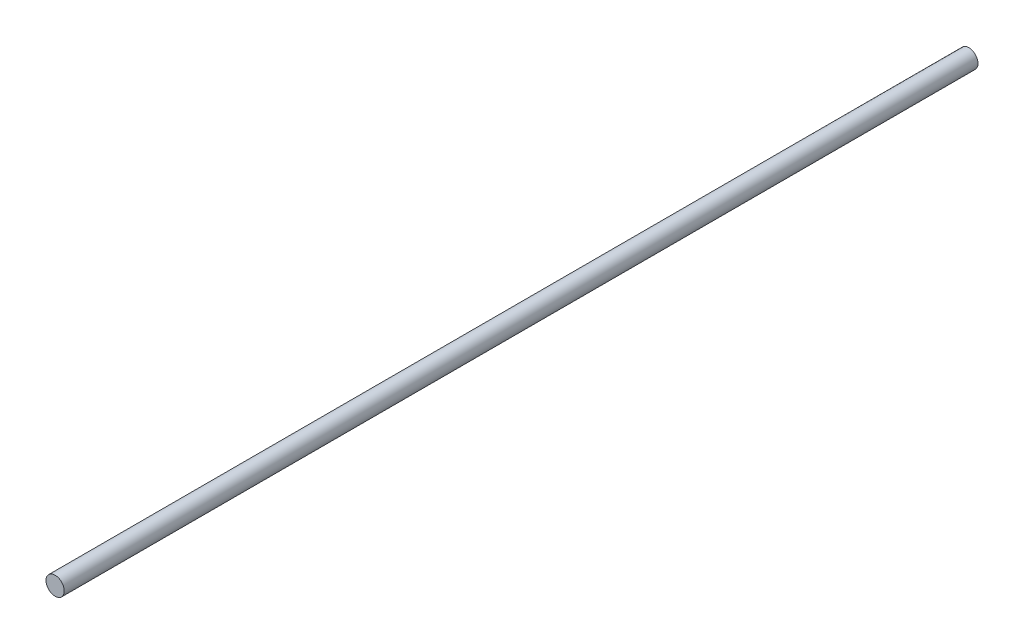
ISO-10303-21;
HEADER;
FILE_DESCRIPTION(('STEP AP214'),'2;1');
FILE_NAME('part.step','',(''),(''),'','','');
FILE_SCHEMA(('AUTOMOTIVE_DESIGN { 1 0 10303 214 1 1 1 1 }'));
ENDSEC;
DATA;
#1=APPLICATION_CONTEXT('core data for automotive mechanical design processes');
#2=APPLICATION_PROTOCOL_DEFINITION('international standard','automotive_design',2000,#1);
#3=PRODUCT_CONTEXT('',#1,'mechanical');
#4=PRODUCT('Part','Part','',(#3));
#5=PRODUCT_RELATED_PRODUCT_CATEGORY('part','',(#4));
#6=PRODUCT_DEFINITION_FORMATION('','',#4);
#7=PRODUCT_DEFINITION_CONTEXT('part definition',#1,'design');
#8=PRODUCT_DEFINITION('design','',#6,#7);
#9=PRODUCT_DEFINITION_SHAPE('','',#8);
#10=(LENGTH_UNIT() NAMED_UNIT(*) SI_UNIT(.MILLI.,.METRE.));
#11=(NAMED_UNIT(*) PLANE_ANGLE_UNIT() SI_UNIT($,.RADIAN.));
#12=(NAMED_UNIT(*) SI_UNIT($,.STERADIAN.) SOLID_ANGLE_UNIT());
#13=UNCERTAINTY_MEASURE_WITH_UNIT(LENGTH_MEASURE(1.E-05),#10,'distance_accuracy_value','');
#14=(GEOMETRIC_REPRESENTATION_CONTEXT(3) GLOBAL_UNCERTAINTY_ASSIGNED_CONTEXT((#13)) GLOBAL_UNIT_ASSIGNED_CONTEXT((#10,
#11,#12)) REPRESENTATION_CONTEXT('',''));
#15=CARTESIAN_POINT('',(0.,0.,0.));
#16=DIRECTION('',(0.,0.,1.));
#17=DIRECTION('',(1.,0.,0.));
#18=AXIS2_PLACEMENT_3D('',#15,#16,#17);
#19=CARTESIAN_POINT('',(0.,0.,250.));
#20=DIRECTION('',(0.,0.,-1.));
#21=DIRECTION('',(-1.,0.,0.));
#22=AXIS2_PLACEMENT_3D('',#19,#20,#21);
#23=CYLINDRICAL_SURFACE('',#22,2.5);
#24=CARTESIAN_POINT('',(0.,0.,250.));
#25=DIRECTION('',(0.,0.,1.));
#26=DIRECTION('',(1.,0.,0.));
#27=AXIS2_PLACEMENT_3D('',#24,#25,#26);
#28=CIRCLE('',#27,2.5);
#29=CARTESIAN_POINT('',(2.5,0.,250.));
#30=VERTEX_POINT('',#29);
#31=EDGE_CURVE('E10',#30,#30,#28,.T.);
#32=ORIENTED_EDGE('',*,*,#31,.F.);
#33=EDGE_LOOP('',(#32));
#34=FACE_BOUND('',#33,.T.);
#35=CARTESIAN_POINT('',(0.,0.,0.));
#36=DIRECTION('',(0.,0.,1.));
#37=DIRECTION('',(1.,0.,0.));
#38=AXIS2_PLACEMENT_3D('',#35,#36,#37);
#39=CIRCLE('',#38,2.5);
#40=CARTESIAN_POINT('',(2.5,0.,0.));
#41=VERTEX_POINT('',#40);
#42=EDGE_CURVE('E34',#41,#41,#39,.T.);
#43=ORIENTED_EDGE('',*,*,#42,.T.);
#44=EDGE_LOOP('',(#43));
#45=FACE_BOUND('',#44,.T.);
#46=ADVANCED_FACE('F31',(#34,#45),#23,.T.);
#47=CARTESIAN_POINT('',(0.,0.,250.));
#48=DIRECTION('',(0.,0.,1.));
#49=DIRECTION('',(1.,0.,0.));
#50=AXIS2_PLACEMENT_3D('',#47,#48,#49);
#51=PLANE('',#50);
#52=ORIENTED_EDGE('',*,*,#31,.T.);
#53=EDGE_LOOP('',(#52));
#54=FACE_BOUND('',#53,.T.);
#55=ADVANCED_FACE('F46',(#54),#51,.T.);
#56=CARTESIAN_POINT('',(0.,0.,0.));
#57=DIRECTION('',(0.,0.,1.));
#58=DIRECTION('',(1.,0.,0.));
#59=AXIS2_PLACEMENT_3D('',#56,#57,#58);
#60=PLANE('',#59);
#61=ORIENTED_EDGE('',*,*,#42,.F.);
#62=EDGE_LOOP('',(#61));
#63=FACE_BOUND('',#62,.T.);
#64=ADVANCED_FACE('F44',(#63),#60,.F.);
#65=CLOSED_SHELL('',(#46,#55,#64));
#66=MANIFOLD_SOLID_BREP('B2',#65);
#67=ADVANCED_BREP_SHAPE_REPRESENTATION('',(#18,#66),#14);
#68=SHAPE_DEFINITION_REPRESENTATION(#9,#67);
ENDSEC;
END-ISO-10303-21;
